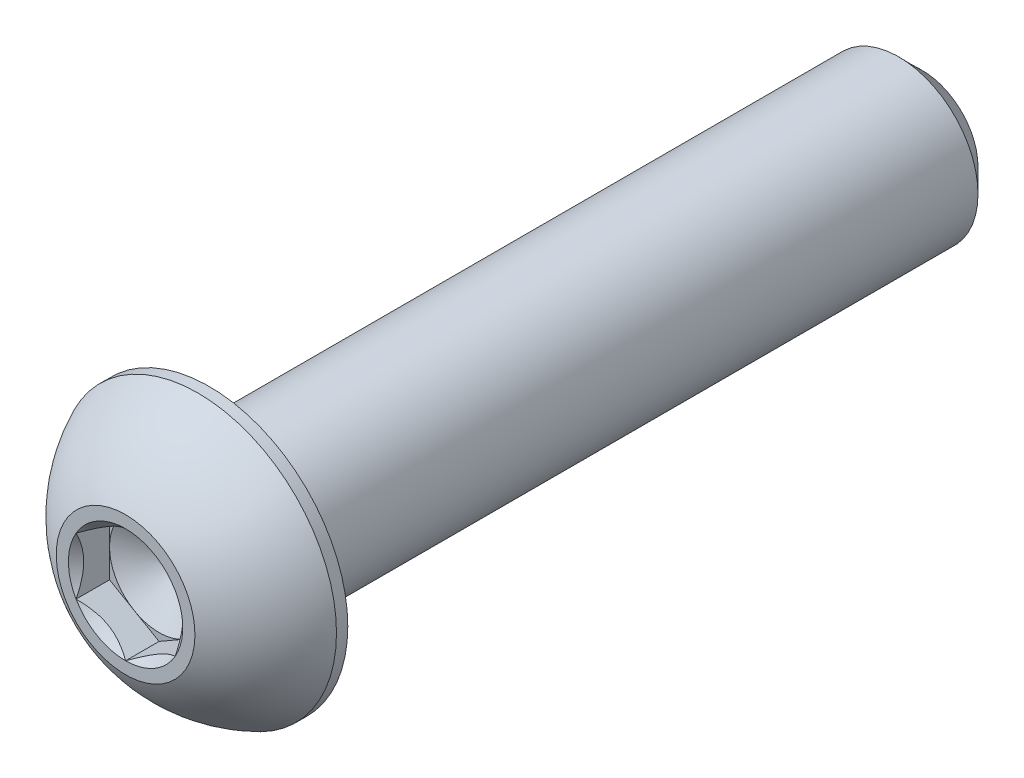
ISO-10303-21;
HEADER;
FILE_DESCRIPTION(('STEP AP214'),'2;1');
FILE_NAME('part.step','',(''),(''),'','','');
FILE_SCHEMA(('AUTOMOTIVE_DESIGN { 1 0 10303 214 1 1 1 1 }'));
ENDSEC;
DATA;
#1=APPLICATION_CONTEXT('core data for automotive mechanical design processes');
#2=APPLICATION_PROTOCOL_DEFINITION('international standard','automotive_design',2000,#1);
#3=PRODUCT_CONTEXT('',#1,'mechanical');
#4=PRODUCT('Part','Part','',(#3));
#5=PRODUCT_RELATED_PRODUCT_CATEGORY('part','',(#4));
#6=PRODUCT_DEFINITION_FORMATION('','',#4);
#7=PRODUCT_DEFINITION_CONTEXT('part definition',#1,'design');
#8=PRODUCT_DEFINITION('design','',#6,#7);
#9=PRODUCT_DEFINITION_SHAPE('','',#8);
#10=(LENGTH_UNIT() NAMED_UNIT(*) SI_UNIT(.MILLI.,.METRE.));
#11=(NAMED_UNIT(*) PLANE_ANGLE_UNIT() SI_UNIT($,.RADIAN.));
#12=(NAMED_UNIT(*) SI_UNIT($,.STERADIAN.) SOLID_ANGLE_UNIT());
#13=UNCERTAINTY_MEASURE_WITH_UNIT(LENGTH_MEASURE(1.E-05),#10,'distance_accuracy_value','');
#14=(GEOMETRIC_REPRESENTATION_CONTEXT(3) GLOBAL_UNCERTAINTY_ASSIGNED_CONTEXT((#13)) GLOBAL_UNIT_ASSIGNED_CONTEXT((#10,
#11,#12)) REPRESENTATION_CONTEXT('',''));
#15=CARTESIAN_POINT('',(0.,0.,0.));
#16=DIRECTION('',(0.,0.,1.));
#17=DIRECTION('',(1.,0.,0.));
#18=AXIS2_PLACEMENT_3D('',#15,#16,#17);
#19=CARTESIAN_POINT('',(0.,1.984375,15.9639));
#20=DIRECTION('',(0.,0.,-1.));
#21=DIRECTION('',(-1.,0.,0.));
#22=AXIS2_PLACEMENT_3D('',#19,#20,#21);
#23=PLANE('',#22);
#24=CARTESIAN_POINT('',(0.,0.,15.9639));
#25=DIRECTION('',(0.,0.,1.));
#26=DIRECTION('',(1.,0.,0.));
#27=AXIS2_PLACEMENT_3D('',#24,#25,#26);
#28=CIRCLE('',#27,2.778125);
#29=CARTESIAN_POINT('',(0.,2.778125,15.9639));
#30=VERTEX_POINT('',#29);
#31=EDGE_CURVE('E169',#30,#30,#28,.T.);
#32=ORIENTED_EDGE('',*,*,#31,.T.);
#33=EDGE_LOOP('',(#32));
#34=FACE_BOUND('',#33,.T.);
#35=CARTESIAN_POINT('',(0.,0.,15.9639));
#36=DIRECTION('',(0.,0.,1.));
#37=DIRECTION('',(1.,0.,0.));
#38=AXIS2_PLACEMENT_3D('',#35,#36,#37);
#39=CIRCLE('',#38,2.29135888084633);
#40=CARTESIAN_POINT('',(0.,2.29135888084633,15.9639));
#41=VERTEX_POINT('',#40);
#42=CARTESIAN_POINT('',(-1.984375,1.14567944042316,15.9639));
#43=VERTEX_POINT('',#42);
#44=EDGE_CURVE('E123',#41,#43,#39,.T.);
#45=ORIENTED_EDGE('',*,*,#44,.F.);
#46=CARTESIAN_POINT('',(0.,0.,15.9639));
#47=DIRECTION('',(0.,0.,1.));
#48=DIRECTION('',(1.,0.,0.));
#49=AXIS2_PLACEMENT_3D('',#46,#47,#48);
#50=CIRCLE('',#49,2.29135888084633);
#51=CARTESIAN_POINT('',(1.984375,1.14567944042316,15.9639));
#52=VERTEX_POINT('',#51);
#53=EDGE_CURVE('E108',#52,#41,#50,.T.);
#54=ORIENTED_EDGE('',*,*,#53,.F.);
#55=CARTESIAN_POINT('',(0.,0.,15.9639));
#56=DIRECTION('',(0.,0.,1.));
#57=DIRECTION('',(1.,0.,0.));
#58=AXIS2_PLACEMENT_3D('',#55,#56,#57);
#59=CIRCLE('',#58,2.29135888084633);
#60=CARTESIAN_POINT('',(1.984375,-1.14567944042316,15.9639));
#61=VERTEX_POINT('',#60);
#62=EDGE_CURVE('E119',#61,#52,#59,.T.);
#63=ORIENTED_EDGE('',*,*,#62,.F.);
#64=CARTESIAN_POINT('',(0.,0.,15.9639));
#65=DIRECTION('',(0.,0.,1.));
#66=DIRECTION('',(1.,0.,0.));
#67=AXIS2_PLACEMENT_3D('',#64,#65,#66);
#68=CIRCLE('',#67,2.29135888084633);
#69=CARTESIAN_POINT('',(0.,-2.29135888084633,15.9639));
#70=VERTEX_POINT('',#69);
#71=EDGE_CURVE('E140',#70,#61,#68,.T.);
#72=ORIENTED_EDGE('',*,*,#71,.F.);
#73=CARTESIAN_POINT('',(0.,0.,15.9639));
#74=DIRECTION('',(0.,0.,1.));
#75=DIRECTION('',(1.,0.,0.));
#76=AXIS2_PLACEMENT_3D('',#73,#74,#75);
#77=CIRCLE('',#76,2.29135888084633);
#78=CARTESIAN_POINT('',(-1.984375,-1.14567944042317,15.9639));
#79=VERTEX_POINT('',#78);
#80=EDGE_CURVE('E440',#79,#70,#77,.T.);
#81=ORIENTED_EDGE('',*,*,#80,.F.);
#82=CARTESIAN_POINT('',(0.,0.,15.9639));
#83=DIRECTION('',(0.,0.,1.));
#84=DIRECTION('',(1.,0.,0.));
#85=AXIS2_PLACEMENT_3D('',#82,#83,#84);
#86=CIRCLE('',#85,2.29135888084633);
#87=EDGE_CURVE('E449',#43,#79,#86,.T.);
#88=ORIENTED_EDGE('',*,*,#87,.F.);
#89=EDGE_LOOP('',(#45,#54,#63,#72,#81,#88));
#90=FACE_BOUND('',#89,.T.);
#91=ADVANCED_FACE('F35',(#34,#90),#23,.F.);
#92=CARTESIAN_POINT('',(0.,0.,-15.9639));
#93=DIRECTION('',(0.,0.,1.));
#94=DIRECTION('',(1.,0.,0.));
#95=AXIS2_PLACEMENT_3D('',#92,#93,#94);
#96=CONICAL_SURFACE('',#95,2.22250000000001,0.785398163397445);
#97=CARTESIAN_POINT('',(0.,0.,-15.0114));
#98=DIRECTION('',(0.,0.,1.));
#99=DIRECTION('',(1.,0.,0.));
#100=AXIS2_PLACEMENT_3D('',#97,#98,#99);
#101=CIRCLE('',#100,3.175);
#102=CARTESIAN_POINT('',(3.175,0.,-15.0114));
#103=VERTEX_POINT('',#102);
#104=EDGE_CURVE('E11',#103,#103,#101,.T.);
#105=ORIENTED_EDGE('',*,*,#104,.F.);
#106=EDGE_LOOP('',(#105));
#107=FACE_BOUND('',#106,.T.);
#108=CARTESIAN_POINT('',(0.,0.,-15.9639));
#109=DIRECTION('',(0.,0.,1.));
#110=DIRECTION('',(1.,0.,0.));
#111=AXIS2_PLACEMENT_3D('',#108,#109,#110);
#112=CIRCLE('',#111,2.22250000000001);
#113=CARTESIAN_POINT('',(2.22250000000001,0.,-15.9639));
#114=VERTEX_POINT('',#113);
#115=EDGE_CURVE('E162',#114,#114,#112,.T.);
#116=ORIENTED_EDGE('',*,*,#115,.T.);
#117=EDGE_LOOP('',(#116));
#118=FACE_BOUND('',#117,.T.);
#119=ADVANCED_FACE('F37',(#107,#118),#96,.T.);
#120=CARTESIAN_POINT('',(0.,0.,15.9639));
#121=DIRECTION('',(0.,0.,1.));
#122=DIRECTION('',(1.,0.,0.));
#123=AXIS2_PLACEMENT_3D('',#120,#121,#122);
#124=CYLINDRICAL_SURFACE('',#123,3.175);
#125=CARTESIAN_POINT('',(0.,0.,12.6111));
#126=DIRECTION('',(0.,0.,1.));
#127=DIRECTION('',(1.,0.,0.));
#128=AXIS2_PLACEMENT_3D('',#125,#126,#127);
#129=CIRCLE('',#128,3.175);
#130=CARTESIAN_POINT('',(3.175,0.,12.6111));
#131=VERTEX_POINT('',#130);
#132=EDGE_CURVE('E43',#131,#131,#129,.T.);
#133=ORIENTED_EDGE('',*,*,#132,.F.);
#134=EDGE_LOOP('',(#133));
#135=FACE_BOUND('',#134,.T.);
#136=ORIENTED_EDGE('',*,*,#104,.T.);
#137=EDGE_LOOP('',(#136));
#138=FACE_BOUND('',#137,.T.);
#139=ADVANCED_FACE('F183',(#135,#138),#124,.T.);
#140=CARTESIAN_POINT('',(0.,5.5499,12.6111));
#141=DIRECTION('',(0.,0.,1.));
#142=DIRECTION('',(1.,0.,0.));
#143=AXIS2_PLACEMENT_3D('',#140,#141,#142);
#144=PLANE('',#143);
#145=CARTESIAN_POINT('',(0.,0.,12.6111));
#146=DIRECTION('',(0.,0.,1.));
#147=DIRECTION('',(1.,0.,0.));
#148=AXIS2_PLACEMENT_3D('',#145,#146,#147);
#149=CIRCLE('',#148,5.5499);
#150=CARTESIAN_POINT('',(5.5499,0.,12.6111));
#151=VERTEX_POINT('',#150);
#152=EDGE_CURVE('E176',#151,#151,#149,.T.);
#153=ORIENTED_EDGE('',*,*,#152,.F.);
#154=EDGE_LOOP('',(#153));
#155=FACE_BOUND('',#154,.T.);
#156=ORIENTED_EDGE('',*,*,#132,.T.);
#157=EDGE_LOOP('',(#156));
#158=FACE_BOUND('',#157,.T.);
#159=ADVANCED_FACE('F181',(#155,#158),#144,.F.);
#160=CARTESIAN_POINT('',(0.,0.,15.9639));
#161=DIRECTION('',(0.,0.,1.));
#162=DIRECTION('',(1.,0.,0.));
#163=AXIS2_PLACEMENT_3D('',#160,#161,#162);
#164=CYLINDRICAL_SURFACE('',#163,5.5499);
#165=CARTESIAN_POINT('',(0.,0.,13.0646714285714));
#166=DIRECTION('',(0.,0.,1.));
#167=DIRECTION('',(1.,0.,0.));
#168=AXIS2_PLACEMENT_3D('',#165,#166,#167);
#169=CIRCLE('',#168,5.5499);
#170=CARTESIAN_POINT('',(0.,5.5499,13.0646714285714));
#171=VERTEX_POINT('',#170);
#172=EDGE_CURVE('E173',#171,#171,#169,.T.);
#173=ORIENTED_EDGE('',*,*,#172,.F.);
#174=EDGE_LOOP('',(#173));
#175=FACE_BOUND('',#174,.T.);
#176=ORIENTED_EDGE('',*,*,#152,.T.);
#177=EDGE_LOOP('',(#176));
#178=FACE_BOUND('',#177,.T.);
#179=ADVANCED_FACE('F202',(#175,#178),#164,.T.);
#180=CARTESIAN_POINT('',(0.,0.,10.5333282068546));
#181=DIRECTION('',(0.,0.,1.));
#182=DIRECTION('',(0.,1.,0.));
#183=AXIS2_PLACEMENT_3D('',#180,#181,#182);
#184=SPHERICAL_SURFACE('',#183,6.09992528775);
#185=CARTESIAN_POINT('',(0.,2.778125,15.9639));
#186=CARTESIAN_POINT('',(0.,2.81602671338564,15.9445106477222));
#187=CARTESIAN_POINT('',(0.,2.85372537445918,15.9247243821891));
#188=CARTESIAN_POINT('',(0.,2.92870021164798,15.8843669699155));
#189=CARTESIAN_POINT('',(0.,2.96597638776324,15.8637958231749));
#190=CARTESIAN_POINT('',(0.,3.04008987470139,15.8218775937889));
#191=CARTESIAN_POINT('',(0.,3.07692718552427,15.8005305111435));
#192=CARTESIAN_POINT('',(0.,3.15014680356086,15.7570697876022));
#193=CARTESIAN_POINT('',(0.,3.18652911077458,15.7349561467063));
#194=CARTESIAN_POINT('',(0.,3.25882276944387,15.6899719956597));
#195=CARTESIAN_POINT('',(0.,3.29473412089945,15.667101485509));
#196=CARTESIAN_POINT('',(0.,3.36607012592493,15.6206136233654));
#197=CARTESIAN_POINT('',(0.,3.40149477949484,15.5969962713726));
#198=CARTESIAN_POINT('',(0.,3.47184185902622,15.5490250785858));
#199=CARTESIAN_POINT('',(0.,3.50676428498768,15.5246712377917));
#200=CARTESIAN_POINT('',(0.,3.57609160000261,15.4752377437818));
#201=CARTESIAN_POINT('',(0.,3.61049648905608,15.4501580905659));
#202=CARTESIAN_POINT('',(0.,3.67877364776563,15.3992839661473));
#203=CARTESIAN_POINT('',(0.,3.71264591742172,15.3734894949444));
#204=CARTESIAN_POINT('',(0.,3.77984298835613,15.3211970423841));
#205=CARTESIAN_POINT('',(0.,3.81316778963445,15.2946990610266));
#206=CARTESIAN_POINT('',(0.,3.87925531482814,15.2410112043859));
#207=CARTESIAN_POINT('',(0.,3.91201803874352,15.2138213291027));
#208=CARTESIAN_POINT('',(0.,3.97696704663191,15.1587616041558));
#209=CARTESIAN_POINT('',(0.,4.00915333060493,15.1308917544921));
#210=CARTESIAN_POINT('',(0.,4.07293534872958,15.0744842984171));
#211=CARTESIAN_POINT('',(0.,4.10453108288122,15.0459466920057));
#212=CARTESIAN_POINT('',(0.,4.16711815037044,14.9882162328008));
#213=CARTESIAN_POINT('',(0.,4.19810948370803,14.9590233800072));
#214=CARTESIAN_POINT('',(0.,4.25947416353471,14.8999952256512));
#215=CARTESIAN_POINT('',(0.,4.28984751002382,14.8701599240888));
#216=CARTESIAN_POINT('',(0.,4.34996290103328,14.8098599514462));
#217=CARTESIAN_POINT('',(0.,4.37970494555363,14.7793952803661));
#218=CARTESIAN_POINT('',(0.,4.43854469425657,14.7178499238436));
#219=CARTESIAN_POINT('',(0.,4.46764239843916,14.6867692384012));
#220=CARTESIAN_POINT('',(0.,4.52518071056457,14.6240054783587));
#221=CARTESIAN_POINT('',(0.,4.55362131850739,14.5923224037587));
#222=CARTESIAN_POINT('',(0.,4.60983297031029,14.5283677546821));
#223=CARTESIAN_POINT('',(0.,4.63760401417035,14.4960961802057));
#224=CARTESIAN_POINT('',(0.,4.6924643634894,14.430978678645));
#225=CARTESIAN_POINT('',(0.,4.71955366894839,14.3981327515608));
#226=CARTESIAN_POINT('',(0.,4.77303866600855,14.3318809438392));
#227=CARTESIAN_POINT('',(0.,4.79943435760973,14.2984750632017));
#228=CARTESIAN_POINT('',(0.,4.85152055556542,14.2311179929015));
#229=CARTESIAN_POINT('',(0.,4.87721106191991,14.1971668032387));
#230=CARTESIAN_POINT('',(0.,4.927875627133,14.1287339984688));
#231=CARTESIAN_POINT('',(0.,4.95284968599158,14.0942523833617));
#232=CARTESIAN_POINT('',(0.,5.00207040804361,14.0247738438145));
#233=CARTESIAN_POINT('',(0.,5.02631707123706,13.9897769193743));
#234=CARTESIAN_POINT('',(0.,5.0740723726572,13.9192831031697));
#235=CARTESIAN_POINT('',(0.,5.09758101088389,13.8837862114053));
#236=CARTESIAN_POINT('',(0.,5.1438499566405,13.8123080217543));
#237=CARTESIAN_POINT('',(0.,5.16661026417041,13.7763267238678));
#238=CARTESIAN_POINT('',(0.,5.21137257072764,13.7038954954669));
#239=CARTESIAN_POINT('',(0.,5.23337456975495,13.6674455649525));
#240=CARTESIAN_POINT('',(0.,5.276610614416,13.5940930504643));
#241=CARTESIAN_POINT('',(0.,5.29784466004975,13.5571904664905));
#242=CARTESIAN_POINT('',(0.,5.33953548787471,13.4829488218128));
#243=CARTESIAN_POINT('',(0.,5.35999227006592,13.445609761109));
#244=CARTESIAN_POINT('',(0.,5.40011960846765,13.370511534306));
#245=CARTESIAN_POINT('',(0.,5.41979016467818,13.3327523682069));
#246=CARTESIAN_POINT('',(0.,5.45833640797136,13.2568304739407));
#247=CARTESIAN_POINT('',(0.,5.47721209505402,13.2186677457736));
#248=CARTESIAN_POINT('',(0.,5.51416039973219,13.1419554930474));
#249=CARTESIAN_POINT('',(0.,5.53223301732771,13.1034059684884));
#250=CARTESIAN_POINT('',(0.,5.5499,13.0646714285714));
#251=B_SPLINE_CURVE_WITH_KNOTS('',3,(#185,#186,#187,#188,#189,#190,#191,#192,#193,#194,#195,
#196,#197,#198,#199,#200,#201,#202,#203,#204,#205,#206,#207,#208,#209,#210,#211,#212,#213,#214,
#215,#216,#217,#218,#219,#220,#221,#222,#223,#224,#225,#226,#227,#228,#229,#230,#231,#232,#233,
#234,#235,#236,#237,#238,#239,#240,#241,#242,#243,#244,#245,#246,#247,#248,#249,#250),
.UNSPECIFIED.,.F.,.F.,(4,2,2,2,2,2,2,2,2,2,2,2,2,2,2,2,2,2,2,2,2,2,2,2,2,2,2,2,2,2,2,2,4),(0.,
0.127717597491553,0.255435194983109,0.383152792474661,0.510870389966215,0.63858798745777,
0.766305584949323,0.894023182440878,1.02174077993243,1.14945837742399,1.27717597491554,
1.40489357240709,1.53261116989865,1.6603287673902,1.78804636488176,1.91576396237331,
2.04348155986486,2.17119915735642,2.29891675484797,2.42663435233953,2.55435194983108,
2.68206954732263,2.80978714481419,2.93750474230574,3.0652223397973,3.19293993728885,
3.32065753478041,3.44837513227196,3.57609272976351,3.70381032725507,3.83152792474662,
3.95924552223817,4.08696311972973),.UNSPECIFIED.);
#252=EDGE_CURVE('BSEAM194',#30,#171,#251,.T.);
#253=ORIENTED_EDGE('',*,*,#31,.F.);
#254=ORIENTED_EDGE('',*,*,#172,.T.);
#255=ORIENTED_EDGE('',*,*,#252,.T.);
#256=ORIENTED_EDGE('',*,*,#252,.F.);
#257=EDGE_LOOP('',(#253,#255,#254,#256));
#258=FACE_BOUND('',#257,.T.);
#259=ADVANCED_FACE('F194',(#258),#184,.T.);
#260=CARTESIAN_POINT('',(0.,2.22250000000001,-15.9639));
#261=DIRECTION('',(0.,0.,1.));
#262=DIRECTION('',(1.,0.,0.));
#263=AXIS2_PLACEMENT_3D('',#260,#261,#262);
#264=PLANE('',#263);
#265=ORIENTED_EDGE('',*,*,#115,.F.);
#266=EDGE_LOOP('',(#265));
#267=FACE_BOUND('',#266,.T.);
#268=ADVANCED_FACE('F192',(#267),#264,.F.);
#269=CARTESIAN_POINT('',(1.984375,1.14567944042316,15.9639));
#270=DIRECTION('',(-0.499999999999999,-0.866025403784439,0.));
#271=DIRECTION('',(0.866025403784439,-0.499999999999999,0.));
#272=AXIS2_PLACEMENT_3D('',#269,#270,#271);
#273=PLANE('',#272);
#274=CARTESIAN_POINT('',(1.984575,1.14556397036933,15.9640154787818));
#275=CARTESIAN_POINT('',(1.9163590048332,1.18494849354192,15.9246628522639));
#276=CARTESIAN_POINT('',(1.84700231489303,1.22499159714897,15.8876213104462));
#277=CARTESIAN_POINT('',(1.70557619954781,1.30664400291398,15.8197988584233));
#278=CARTESIAN_POINT('',(1.63349332126322,1.34826107209555,15.7890556890918));
#279=CARTESIAN_POINT('',(1.488141602734,1.43217992591557,15.7363918888112));
#280=CARTESIAN_POINT('',(1.41490978751306,1.47446033414663,15.71433887588));
#281=CARTESIAN_POINT('',(1.26683381740529,1.55995203534886,15.6803614929439));
#282=CARTESIAN_POINT('',(1.19199418724658,1.60316071596705,15.6684117560917));
#283=CARTESIAN_POINT('',(1.06301458545618,1.6776271237807,15.6576300990819));
#284=CARTESIAN_POINT('',(1.00904128422756,1.7087886237741,15.6560338990591));
#285=CARTESIAN_POINT('',(0.901182881480199,1.77106070163465,15.6587218388653));
#286=CARTESIAN_POINT('',(0.847297817514476,1.80217125782056,15.6630080403405));
#287=CARTESIAN_POINT('',(0.740036461751395,1.86409863044402,15.6772168730135));
#288=CARTESIAN_POINT('',(0.686660807239859,1.89491507894443,15.6871458104523));
#289=CARTESIAN_POINT('',(0.580832482591103,1.95601509066828,15.7120950842745));
#290=CARTESIAN_POINT('',(0.528379742028898,1.9862986945516,15.7271150303895));
#291=CARTESIAN_POINT('',(0.39401766103635,2.06387267818152,15.7717078516357));
#292=CARTESIAN_POINT('',(0.312941642841674,2.11068193911104,15.8046429959383));
#293=CARTESIAN_POINT('',(0.19372669327016,2.17951072233758,15.8602424412022));
#294=CARTESIAN_POINT('',(0.154440075613998,2.20219286161692,15.8797775920519));
#295=CARTESIAN_POINT('',(0.0765946381319468,2.24713694590237,15.9206287381194));
#296=CARTESIAN_POINT('',(0.0380353888983003,2.26939913882716,15.9419436395684));
#297=CARTESIAN_POINT('',(-0.000200000000001343,2.29147435090017,15.9640154787818));
#298=B_SPLINE_CURVE_WITH_KNOTS('',3,(#274,#275,#276,#277,#278,#279,#280,#281,#282,#283,#284,
#285,#286,#287,#288,#289,#290,#291,#292,#293,#294,#295,#296,#297),.UNSPECIFIED.,.F.,.F.,(4,2,2,
2,2,2,2,2,2,2,2,4),(0.,0.264339630306628,0.530219665093697,0.791876416371462,1.05287424418109,
1.239639843932,1.42647091743852,1.61351120244035,1.80053715247541,2.09764209964317,
2.24579179873714,2.39385111134157),.UNSPECIFIED.);
#299=EDGE_CURVE('E105',#52,#41,#298,.T.);
#300=ORIENTED_EDGE('',*,*,#299,.T.);
#301=DIRECTION('',(0.,0.,-1.));
#302=VECTOR('',#301,1.);
#303=CARTESIAN_POINT('',(0.,2.29135888084633,15.9639));
#304=LINE('',#303,#302);
#305=CARTESIAN_POINT('',(0.,2.29135888084633,14.62278));
#306=VERTEX_POINT('',#305);
#307=EDGE_CURVE('E160',#41,#306,#304,.T.);
#308=ORIENTED_EDGE('',*,*,#307,.T.);
#309=DIRECTION('',(-0.866025403784439,0.499999999999999,0.));
#310=VECTOR('',#309,1.);
#311=CARTESIAN_POINT('',(1.984375,1.14567944042316,14.62278));
#312=LINE('',#311,#310);
#313=CARTESIAN_POINT('',(0.992187499999998,1.71851916063475,14.62278));
#314=VERTEX_POINT('',#313);
#315=EDGE_CURVE('E476',#314,#306,#312,.T.);
#316=ORIENTED_EDGE('',*,*,#315,.F.);
#317=CARTESIAN_POINT('',(1.984375,1.14567944042316,14.62278));
#318=VERTEX_POINT('',#317);
#319=EDGE_CURVE('E50',#318,#314,#312,.T.);
#320=ORIENTED_EDGE('',*,*,#319,.F.);
#321=DIRECTION('',(0.,0.,-1.));
#322=VECTOR('',#321,1.);
#323=CARTESIAN_POINT('',(1.984375,1.14567944042316,15.9639));
#324=LINE('',#323,#322);
#325=EDGE_CURVE('E136',#52,#318,#324,.T.);
#326=ORIENTED_EDGE('',*,*,#325,.F.);
#327=EDGE_LOOP('',(#300,#308,#316,#320,#326));
#328=FACE_BOUND('',#327,.T.);
#329=ADVANCED_FACE('F142',(#328),#273,.T.);
#330=CARTESIAN_POINT('',(0.,2.29135888084633,15.9639));
#331=DIRECTION('',(0.5,-0.866025403784438,0.));
#332=DIRECTION('',(0.866025403784438,0.5,0.));
#333=AXIS2_PLACEMENT_3D('',#330,#331,#332);
#334=PLANE('',#333);
#335=CARTESIAN_POINT('',(0.000199999999998693,2.29147435090016,15.9640154787818));
#336=CARTESIAN_POINT('',(-0.0680159951668039,2.25208982772757,15.9246628522639));
#337=CARTESIAN_POINT('',(-0.137372685106967,2.21204672412052,15.8876213104462));
#338=CARTESIAN_POINT('',(-0.278798800452189,2.13039431835551,15.8197988584233));
#339=CARTESIAN_POINT('',(-0.350881678736783,2.08877724917394,15.7890556890918));
#340=CARTESIAN_POINT('',(-0.496233397266004,2.00485839535392,15.7363918888112));
#341=CARTESIAN_POINT('',(-0.569465212486939,1.96257798712287,15.71433887588));
#342=CARTESIAN_POINT('',(-0.717541182594706,1.87708628592063,15.6803614929439));
#343=CARTESIAN_POINT('',(-0.792380812753424,1.83387760530244,15.6684117560917));
#344=CARTESIAN_POINT('',(-0.921360414543814,1.75941119748879,15.6576300990819));
#345=CARTESIAN_POINT('',(-0.975333715772441,1.72824969749539,15.6560338990591));
#346=CARTESIAN_POINT('',(-1.0831921185198,1.66597761963484,15.6587218388653));
#347=CARTESIAN_POINT('',(-1.13707718248552,1.63486706344893,15.6630080403405));
#348=CARTESIAN_POINT('',(-1.2443385382486,1.57293969082547,15.6772168730135));
#349=CARTESIAN_POINT('',(-1.29771419276014,1.54212324232506,15.6871458104523));
#350=CARTESIAN_POINT('',(-1.4035425174089,1.48102323060122,15.7120950842745));
#351=CARTESIAN_POINT('',(-1.4559952579711,1.45073962671789,15.7271150303895));
#352=CARTESIAN_POINT('',(-1.59035733896365,1.37316564308797,15.7717078516357));
#353=CARTESIAN_POINT('',(-1.67143335715832,1.32635638215845,15.8046429959383));
#354=CARTESIAN_POINT('',(-1.79064830672984,1.25752759893191,15.8602424412022));
#355=CARTESIAN_POINT('',(-1.829934924386,1.23484545965257,15.8797775920519));
#356=CARTESIAN_POINT('',(-1.90778036186805,1.18990137536712,15.9206287381194));
#357=CARTESIAN_POINT('',(-1.9463396111017,1.16763918244233,15.9419436395684));
#358=CARTESIAN_POINT('',(-1.984575,1.14556397036932,15.9640154787818));
#359=B_SPLINE_CURVE_WITH_KNOTS('',3,(#335,#336,#337,#338,#339,#340,#341,#342,#343,#344,#345,
#346,#347,#348,#349,#350,#351,#352,#353,#354,#355,#356,#357,#358),.UNSPECIFIED.,.F.,.F.,(4,2,2,
2,2,2,2,2,2,2,2,4),(0.,0.264339630306627,0.530219665093694,0.791876416371458,1.05287424418109,
1.239639843932,1.42647091743852,1.61351120244034,1.8005371524754,2.09764209964316,
2.24579179873714,2.39385111134157),.UNSPECIFIED.);
#360=EDGE_CURVE('E464',#41,#43,#359,.T.);
#361=ORIENTED_EDGE('',*,*,#360,.T.);
#362=DIRECTION('',(0.,0.,-1.));
#363=VECTOR('',#362,1.);
#364=CARTESIAN_POINT('',(-1.984375,1.14567944042316,15.9639));
#365=LINE('',#364,#363);
#366=CARTESIAN_POINT('',(-1.984375,1.14567944042316,14.62278));
#367=VERTEX_POINT('',#366);
#368=EDGE_CURVE('E157',#43,#367,#365,.T.);
#369=ORIENTED_EDGE('',*,*,#368,.T.);
#370=DIRECTION('',(-0.866025403784438,-0.5,0.));
#371=VECTOR('',#370,1.);
#372=CARTESIAN_POINT('',(0.,2.29135888084633,14.62278));
#373=LINE('',#372,#371);
#374=CARTESIAN_POINT('',(-0.992187500000001,1.71851916063474,14.62278));
#375=VERTEX_POINT('',#374);
#376=EDGE_CURVE('E478',#375,#367,#373,.T.);
#377=ORIENTED_EDGE('',*,*,#376,.F.);
#378=EDGE_CURVE('E479',#306,#375,#373,.T.);
#379=ORIENTED_EDGE('',*,*,#378,.F.);
#380=ORIENTED_EDGE('',*,*,#307,.F.);
#381=EDGE_LOOP('',(#361,#369,#377,#379,#380));
#382=FACE_BOUND('',#381,.T.);
#383=ADVANCED_FACE('F200',(#382),#334,.T.);
#384=CARTESIAN_POINT('',(-1.984375,1.14567944042316,15.9639));
#385=DIRECTION('',(1.,0.,0.));
#386=DIRECTION('',(0.,0.,-1.));
#387=AXIS2_PLACEMENT_3D('',#384,#385,#386);
#388=PLANE('',#387);
#389=CARTESIAN_POINT('',(-1.984375,-2.24664989492636,16.6700700833169));
#390=CARTESIAN_POINT('',(-1.984375,-2.19177035879914,16.6289466992886));
#391=CARTESIAN_POINT('',(-1.984375,-2.1365793309425,16.5882329661326));
#392=CARTESIAN_POINT('',(-1.984375,-2.0254530694156,16.5078048670618));
#393=CARTESIAN_POINT('',(-1.984375,-1.9695176484433,16.4680907602265));
#394=CARTESIAN_POINT('',(-1.984375,-1.85637247000972,16.3895599960499));
#395=CARTESIAN_POINT('',(-1.984375,-1.79915619451492,16.3507526850203));
#396=CARTESIAN_POINT('',(-1.984375,-1.68374612486123,16.2746311665578));
#397=CARTESIAN_POINT('',(-1.984375,-1.62555240093273,16.2373168524981));
#398=CARTESIAN_POINT('',(-1.984375,-1.44283684202777,16.124067942359));
#399=CARTESIAN_POINT('',(-1.984375,-1.31636516124236,16.0512214191006));
#400=CARTESIAN_POINT('',(-1.984375,-1.05716498260296,15.9182117557776));
#401=CARTESIAN_POINT('',(-1.984375,-0.924459462264124,15.8580059196547));
#402=CARTESIAN_POINT('',(-1.984375,-0.724893074141589,15.7843618396154));
#403=CARTESIAN_POINT('',(-1.984375,-0.660907572248813,15.7631629174856));
#404=CARTESIAN_POINT('',(-1.984375,-0.531425551080247,15.7259071147974));
#405=CARTESIAN_POINT('',(-1.984375,-0.465928924835295,15.7098505994633));
#406=CARTESIAN_POINT('',(-1.984375,-0.334891945890407,15.6839708434592));
#407=CARTESIAN_POINT('',(-1.984375,-0.269372555502923,15.6740431015484));
#408=CARTESIAN_POINT('',(-1.984375,-0.137675185771463,15.6606085903106));
#409=CARTESIAN_POINT('',(-1.984375,-0.071497313578065,15.6571007929468));
#410=CARTESIAN_POINT('',(-1.984375,0.0586431546448462,15.6567516482374));
#411=CARTESIAN_POINT('',(-1.984375,0.122605247687116,15.6596896245911));
#412=CARTESIAN_POINT('',(-1.984375,0.249962419599662,15.6715917091826));
#413=CARTESIAN_POINT('',(-1.984375,0.313357441624569,15.6805564148524));
#414=CARTESIAN_POINT('',(-1.984375,0.440194078343454,15.7041811503476));
#415=CARTESIAN_POINT('',(-1.984375,0.503617615772963,15.7189367997364));
#416=CARTESIAN_POINT('',(-1.984375,0.629083701047628,15.7533707574727));
#417=CARTESIAN_POINT('',(-1.984375,0.691126376772747,15.773048607898));
#418=CARTESIAN_POINT('',(-1.984375,0.888252191671361,15.8429251863326));
#419=CARTESIAN_POINT('',(-1.984375,1.02048040542614,15.9011555893404));
#420=CARTESIAN_POINT('',(-1.984375,1.27871806100266,16.0305691802767));
#421=CARTESIAN_POINT('',(-1.984375,1.40470281207755,16.1017992719574));
#422=CARTESIAN_POINT('',(-1.984375,1.5867785992022,16.2129129319412));
#423=CARTESIAN_POINT('',(-1.984375,1.64484387516128,16.2496238248926));
#424=CARTESIAN_POINT('',(-1.984375,1.75997827817988,16.3245874476375));
#425=CARTESIAN_POINT('',(-1.984375,1.81704732901583,16.3628402946748));
#426=CARTESIAN_POINT('',(-1.984375,1.92985499213403,16.4402867819938));
#427=CARTESIAN_POINT('',(-1.984375,1.98560066211377,16.4794701932287));
#428=CARTESIAN_POINT('',(-1.984375,2.09633159947626,16.5588666099261));
#429=CARTESIAN_POINT('',(-1.984375,2.15131707145808,16.5990793297131));
#430=CARTESIAN_POINT('',(-1.984375,2.20598450458982,16.63971347261));
#431=B_SPLINE_CURVE_WITH_KNOTS('',3,(#389,#390,#391,#392,#393,#394,#395,#396,#397,#398,#399,
#400,#401,#402,#403,#404,#405,#406,#407,#408,#409,#410,#411,#412,#413,#414,#415,#416,#417,#418,
#419,#420,#421,#422,#423,#424,#425,#426,#427,#428,#429,#430),.UNSPECIFIED.,.F.,.F.,(4,2,2,2,2,2,
2,2,2,2,2,2,2,2,2,2,2,2,2,2,4),(0.,0.205736210356763,0.411525204809806,0.618909845914795,
0.826279649489807,1.26374370453551,1.69970549535382,1.90175047418286,2.10380979948048,
2.3023211047986,2.50080061937433,2.69259135253523,2.88440110079442,3.07952109080018,
3.27462293514803,3.70679897011889,4.14056631296021,4.34663769336142,4.552724772271,
4.75712951108819,4.96147812147718),.UNSPECIFIED.);
#432=EDGE_CURVE('E457',#43,#79,#431,.F.);
#433=ORIENTED_EDGE('',*,*,#432,.T.);
#434=DIRECTION('',(0.,0.,-1.));
#435=VECTOR('',#434,1.);
#436=CARTESIAN_POINT('',(-1.984375,-1.14567944042317,15.9639));
#437=LINE('',#436,#435);
#438=CARTESIAN_POINT('',(-1.984375,-1.14567944042317,14.62278));
#439=VERTEX_POINT('',#438);
#440=EDGE_CURVE('E154',#79,#439,#437,.T.);
#441=ORIENTED_EDGE('',*,*,#440,.T.);
#442=DIRECTION('',(0.,-1.,0.));
#443=VECTOR('',#442,1.);
#444=CARTESIAN_POINT('',(-1.984375,1.14567944042316,14.62278));
#445=LINE('',#444,#443);
#446=CARTESIAN_POINT('',(-1.984375,0.,14.62278));
#447=VERTEX_POINT('',#446);
#448=EDGE_CURVE('E482',#447,#439,#445,.T.);
#449=ORIENTED_EDGE('',*,*,#448,.F.);
#450=EDGE_CURVE('E483',#367,#447,#445,.T.);
#451=ORIENTED_EDGE('',*,*,#450,.F.);
#452=ORIENTED_EDGE('',*,*,#368,.F.);
#453=EDGE_LOOP('',(#433,#441,#449,#451,#452));
#454=FACE_BOUND('',#453,.T.);
#455=ADVANCED_FACE('F321',(#454),#388,.T.);
#456=CARTESIAN_POINT('',(-1.984375,-1.14567944042317,15.9639));
#457=DIRECTION('',(0.499999999999999,0.866025403784439,0.));
#458=DIRECTION('',(-0.866025403784439,0.5,0.));
#459=AXIS2_PLACEMENT_3D('',#456,#457,#458);
#460=PLANE('',#459);
#461=CARTESIAN_POINT('',(-1.984575,-1.14556397036933,15.9640154787818));
#462=CARTESIAN_POINT('',(-1.9163590048332,-1.18494849354192,15.9246628522639));
#463=CARTESIAN_POINT('',(-1.84700231489304,-1.22499159714897,15.8876213104462));
#464=CARTESIAN_POINT('',(-1.70557619954782,-1.30664400291398,15.8197988584233));
#465=CARTESIAN_POINT('',(-1.63349332126322,-1.34826107209555,15.7890556890918));
#466=CARTESIAN_POINT('',(-1.488141602734,-1.43217992591557,15.7363918888112));
#467=CARTESIAN_POINT('',(-1.41490978751307,-1.47446033414662,15.71433887588));
#468=CARTESIAN_POINT('',(-1.2668338174053,-1.55995203534886,15.6803614929439));
#469=CARTESIAN_POINT('',(-1.19199418724658,-1.60316071596705,15.6684117560917));
#470=CARTESIAN_POINT('',(-1.06301458545619,-1.6776271237807,15.6576300990819));
#471=CARTESIAN_POINT('',(-1.00904128422756,-1.7087886237741,15.6560338990591));
#472=CARTESIAN_POINT('',(-0.901182881480203,-1.77106070163465,15.6587218388653));
#473=CARTESIAN_POINT('',(-0.84729781751448,-1.80217125782056,15.6630080403405));
#474=CARTESIAN_POINT('',(-0.740036461751399,-1.86409863044402,15.6772168730135));
#475=CARTESIAN_POINT('',(-0.686660807239863,-1.89491507894443,15.6871458104523));
#476=CARTESIAN_POINT('',(-0.580832482591107,-1.95601509066827,15.7120950842745));
#477=CARTESIAN_POINT('',(-0.528379742028902,-1.9862986945516,15.7271150303895));
#478=CARTESIAN_POINT('',(-0.394017661036354,-2.06387267818152,15.7717078516357));
#479=CARTESIAN_POINT('',(-0.312941642841679,-2.11068193911104,15.8046429959383));
#480=CARTESIAN_POINT('',(-0.193726693270162,-2.17951072233758,15.8602424412022));
#481=CARTESIAN_POINT('',(-0.154440075613999,-2.20219286161692,15.8797775920519));
#482=CARTESIAN_POINT('',(-0.0765946381319461,-2.24713694590237,15.9206287381194));
#483=CARTESIAN_POINT('',(-0.0380353888983,-2.26939913882716,15.9419436395684));
#484=CARTESIAN_POINT('',(0.00020000000000092,-2.29147435090017,15.9640154787818));
#485=B_SPLINE_CURVE_WITH_KNOTS('',3,(#461,#462,#463,#464,#465,#466,#467,#468,#469,#470,#471,
#472,#473,#474,#475,#476,#477,#478,#479,#480,#481,#482,#483,#484),.UNSPECIFIED.,.F.,.F.,(4,2,2,
2,2,2,2,2,2,2,2,4),(0.,0.264339630306622,0.530219665093689,0.791876416371455,1.05287424418109,
1.239639843932,1.42647091743852,1.61351120244034,1.8005371524754,2.09764209964316,
2.24579179873713,2.39385111134157),.UNSPECIFIED.);
#486=EDGE_CURVE('E442',#79,#70,#485,.T.);
#487=ORIENTED_EDGE('',*,*,#486,.T.);
#488=DIRECTION('',(0.,0.,-1.));
#489=VECTOR('',#488,1.);
#490=CARTESIAN_POINT('',(0.,-2.29135888084633,15.9639));
#491=LINE('',#490,#489);
#492=CARTESIAN_POINT('',(0.,-2.29135888084633,14.62278));
#493=VERTEX_POINT('',#492);
#494=EDGE_CURVE('E145',#70,#493,#491,.T.);
#495=ORIENTED_EDGE('',*,*,#494,.T.);
#496=DIRECTION('',(0.866025403784439,-0.499999999999999,0.));
#497=VECTOR('',#496,1.);
#498=CARTESIAN_POINT('',(-1.984375,-1.14567944042317,14.62278));
#499=LINE('',#498,#497);
#500=CARTESIAN_POINT('',(-0.992187499999999,-1.71851916063475,14.62278));
#501=VERTEX_POINT('',#500);
#502=EDGE_CURVE('E486',#501,#493,#499,.T.);
#503=ORIENTED_EDGE('',*,*,#502,.F.);
#504=EDGE_CURVE('E487',#439,#501,#499,.T.);
#505=ORIENTED_EDGE('',*,*,#504,.F.);
#506=ORIENTED_EDGE('',*,*,#440,.F.);
#507=EDGE_LOOP('',(#487,#495,#503,#505,#506));
#508=FACE_BOUND('',#507,.T.);
#509=ADVANCED_FACE('F331',(#508),#460,.T.);
#510=CARTESIAN_POINT('',(0.,-2.29135888084633,15.9639));
#511=DIRECTION('',(-0.5,0.866025403784438,0.));
#512=DIRECTION('',(-0.866025403784438,-0.5,0.));
#513=AXIS2_PLACEMENT_3D('',#510,#511,#512);
#514=PLANE('',#513);
#515=CARTESIAN_POINT('',(-0.000199999999997776,-2.29147435090017,15.9640154787818));
#516=CARTESIAN_POINT('',(0.0680159951668048,-2.25208982772757,15.9246628522639));
#517=CARTESIAN_POINT('',(0.137372685106968,-2.21204672412052,15.8876213104462));
#518=CARTESIAN_POINT('',(0.278798800452189,-2.13039431835551,15.8197988584233));
#519=CARTESIAN_POINT('',(0.350881678736785,-2.08877724917394,15.7890556890918));
#520=CARTESIAN_POINT('',(0.496233397266005,-2.00485839535392,15.7363918888112));
#521=CARTESIAN_POINT('',(0.569465212486939,-1.96257798712287,15.71433887588));
#522=CARTESIAN_POINT('',(0.717541182594707,-1.87708628592063,15.6803614929439));
#523=CARTESIAN_POINT('',(0.792380812753426,-1.83387760530244,15.6684117560917));
#524=CARTESIAN_POINT('',(0.921360414543818,-1.75941119748879,15.6576300990819));
#525=CARTESIAN_POINT('',(0.975333715772444,-1.72824969749539,15.6560338990591));
#526=CARTESIAN_POINT('',(1.0831921185198,-1.66597761963484,15.6587218388653));
#527=CARTESIAN_POINT('',(1.13707718248553,-1.63486706344893,15.6630080403405));
#528=CARTESIAN_POINT('',(1.24433853824861,-1.57293969082547,15.6772168730135));
#529=CARTESIAN_POINT('',(1.29771419276014,-1.54212324232506,15.6871458104523));
#530=CARTESIAN_POINT('',(1.4035425174089,-1.48102323060122,15.7120950842745));
#531=CARTESIAN_POINT('',(1.4559952579711,-1.45073962671789,15.7271150303895));
#532=CARTESIAN_POINT('',(1.59035733896365,-1.37316564308797,15.7717078516357));
#533=CARTESIAN_POINT('',(1.67143335715833,-1.32635638215845,15.8046429959383));
#534=CARTESIAN_POINT('',(1.79064830672984,-1.25752759893191,15.8602424412022));
#535=CARTESIAN_POINT('',(1.829934924386,-1.23484545965257,15.8797775920519));
#536=CARTESIAN_POINT('',(1.90778036186805,-1.18990137536713,15.9206287381194));
#537=CARTESIAN_POINT('',(1.9463396111017,-1.16763918244233,15.9419436395684));
#538=CARTESIAN_POINT('',(1.984575,-1.14556397036933,15.9640154787818));
#539=B_SPLINE_CURVE_WITH_KNOTS('',3,(#515,#516,#517,#518,#519,#520,#521,#522,#523,#524,#525,
#526,#527,#528,#529,#530,#531,#532,#533,#534,#535,#536,#537,#538),.UNSPECIFIED.,.F.,.F.,(4,2,2,
2,2,2,2,2,2,2,2,4),(0.,0.264339630306625,0.530219665093692,0.791876416371457,1.05287424418109,
1.239639843932,1.42647091743852,1.61351120244034,1.8005371524754,2.09764209964316,
2.24579179873713,2.39385111134157),.UNSPECIFIED.);
#540=EDGE_CURVE('E433',#70,#61,#539,.T.);
#541=ORIENTED_EDGE('',*,*,#540,.T.);
#542=DIRECTION('',(0.,0.,-1.));
#543=VECTOR('',#542,1.);
#544=CARTESIAN_POINT('',(1.984375,-1.14567944042316,15.9639));
#545=LINE('',#544,#543);
#546=CARTESIAN_POINT('',(1.984375,-1.14567944042316,14.62278));
#547=VERTEX_POINT('',#546);
#548=EDGE_CURVE('E139',#61,#547,#545,.T.);
#549=ORIENTED_EDGE('',*,*,#548,.T.);
#550=DIRECTION('',(0.866025403784438,0.5,0.));
#551=VECTOR('',#550,1.);
#552=CARTESIAN_POINT('',(0.,-2.29135888084633,14.62278));
#553=LINE('',#552,#551);
#554=CARTESIAN_POINT('',(0.992187500000001,-1.71851916063475,14.62278));
#555=VERTEX_POINT('',#554);
#556=EDGE_CURVE('E489',#555,#547,#553,.T.);
#557=ORIENTED_EDGE('',*,*,#556,.F.);
#558=EDGE_CURVE('E490',#493,#555,#553,.T.);
#559=ORIENTED_EDGE('',*,*,#558,.F.);
#560=ORIENTED_EDGE('',*,*,#494,.F.);
#561=EDGE_LOOP('',(#541,#549,#557,#559,#560));
#562=FACE_BOUND('',#561,.T.);
#563=ADVANCED_FACE('F341',(#562),#514,.T.);
#564=CARTESIAN_POINT('',(1.984375,-1.14567944042316,15.9639));
#565=DIRECTION('',(-1.,0.,0.));
#566=DIRECTION('',(0.,-1.,0.));
#567=AXIS2_PLACEMENT_3D('',#564,#565,#566);
#568=PLANE('',#567);
#569=CARTESIAN_POINT('',(1.984375,-2.24664989492635,16.6700700833169));
#570=CARTESIAN_POINT('',(1.984375,-2.19177035879913,16.6289466992886));
#571=CARTESIAN_POINT('',(1.984375,-2.1365793309425,16.5882329661326));
#572=CARTESIAN_POINT('',(1.984375,-2.0254530694156,16.5078048670618));
#573=CARTESIAN_POINT('',(1.984375,-1.96951764844329,16.4680907602265));
#574=CARTESIAN_POINT('',(1.984375,-1.85637247000972,16.3895599960499));
#575=CARTESIAN_POINT('',(1.984375,-1.79915619451491,16.3507526850203));
#576=CARTESIAN_POINT('',(1.984375,-1.68374612486123,16.2746311665578));
#577=CARTESIAN_POINT('',(1.984375,-1.62555240093273,16.2373168524981));
#578=CARTESIAN_POINT('',(1.984375,-1.44283684202776,16.124067942359));
#579=CARTESIAN_POINT('',(1.984375,-1.31636516124235,16.0512214191006));
#580=CARTESIAN_POINT('',(1.984375,-1.05716498260296,15.9182117557776));
#581=CARTESIAN_POINT('',(1.984375,-0.92445946226412,15.8580059196547));
#582=CARTESIAN_POINT('',(1.984375,-0.724893074141586,15.7843618396154));
#583=CARTESIAN_POINT('',(1.984375,-0.660907572248812,15.7631629174856));
#584=CARTESIAN_POINT('',(1.984375,-0.531425551080246,15.7259071147974));
#585=CARTESIAN_POINT('',(1.984375,-0.465928924835294,15.7098505994633));
#586=CARTESIAN_POINT('',(1.984375,-0.334891945890404,15.6839708434592));
#587=CARTESIAN_POINT('',(1.984375,-0.26937255550292,15.6740431015484));
#588=CARTESIAN_POINT('',(1.984375,-0.137675185771461,15.6606085903106));
#589=CARTESIAN_POINT('',(1.984375,-0.0714973135780629,15.6571007929468));
#590=CARTESIAN_POINT('',(1.984375,0.0586431546448481,15.6567516482373));
#591=CARTESIAN_POINT('',(1.984375,0.122605247687119,15.6596896245911));
#592=CARTESIAN_POINT('',(1.984375,0.249962419599664,15.6715917091826));
#593=CARTESIAN_POINT('',(1.984375,0.313357441624571,15.6805564148524));
#594=CARTESIAN_POINT('',(1.984375,0.440194078343455,15.7041811503476));
#595=CARTESIAN_POINT('',(1.984375,0.503617615772964,15.7189367997364));
#596=CARTESIAN_POINT('',(1.984375,0.629083701047629,15.7533707574727));
#597=CARTESIAN_POINT('',(1.984375,0.691126376772749,15.773048607898));
#598=CARTESIAN_POINT('',(1.984375,0.888252191671362,15.8429251863326));
#599=CARTESIAN_POINT('',(1.984375,1.02048040542614,15.9011555893404));
#600=CARTESIAN_POINT('',(1.984375,1.27871806100267,16.0305691802767));
#601=CARTESIAN_POINT('',(1.984375,1.40470281207756,16.1017992719575));
#602=CARTESIAN_POINT('',(1.984375,1.5867785992022,16.2129129319412));
#603=CARTESIAN_POINT('',(1.984375,1.64484387516129,16.2496238248926));
#604=CARTESIAN_POINT('',(1.984375,1.75997827817988,16.3245874476375));
#605=CARTESIAN_POINT('',(1.984375,1.81704732901584,16.3628402946748));
#606=CARTESIAN_POINT('',(1.984375,1.92985499213404,16.4402867819938));
#607=CARTESIAN_POINT('',(1.984375,1.98560066211377,16.4794701932287));
#608=CARTESIAN_POINT('',(1.984375,2.09633159947626,16.5588666099261));
#609=CARTESIAN_POINT('',(1.984375,2.15131707145809,16.5990793297131));
#610=CARTESIAN_POINT('',(1.984375,2.20598450458982,16.63971347261));
#611=B_SPLINE_CURVE_WITH_KNOTS('',3,(#569,#570,#571,#572,#573,#574,#575,#576,#577,#578,#579,
#580,#581,#582,#583,#584,#585,#586,#587,#588,#589,#590,#591,#592,#593,#594,#595,#596,#597,#598,
#599,#600,#601,#602,#603,#604,#605,#606,#607,#608,#609,#610),.UNSPECIFIED.,.F.,.F.,(4,2,2,2,2,2,
2,2,2,2,2,2,2,2,2,2,2,2,2,2,4),(0.,0.205736210356767,0.411525204809808,0.618909845914794,
0.826279649489806,1.26374370453551,1.69970549535382,1.90175047418286,2.10380979948048,
2.3023211047986,2.50080061937433,2.69259135253523,2.88440110079442,3.07952109080018,
3.27462293514803,3.70679897011888,4.14056631296021,4.34663769336142,4.552724772271,
4.75712951108819,4.96147812147718),.UNSPECIFIED.);
#612=EDGE_CURVE('E129',#61,#52,#611,.T.);
#613=ORIENTED_EDGE('',*,*,#612,.T.);
#614=ORIENTED_EDGE('',*,*,#325,.T.);
#615=DIRECTION('',(0.,1.,0.));
#616=VECTOR('',#615,1.);
#617=CARTESIAN_POINT('',(1.984375,-1.14567944042316,14.62278));
#618=LINE('',#617,#616);
#619=CARTESIAN_POINT('',(1.984375,0.,14.62278));
#620=VERTEX_POINT('',#619);
#621=EDGE_CURVE('E148',#620,#318,#618,.T.);
#622=ORIENTED_EDGE('',*,*,#621,.F.);
#623=EDGE_CURVE('E143',#547,#620,#618,.T.);
#624=ORIENTED_EDGE('',*,*,#623,.F.);
#625=ORIENTED_EDGE('',*,*,#548,.F.);
#626=EDGE_LOOP('',(#613,#614,#622,#624,#625));
#627=FACE_BOUND('',#626,.T.);
#628=ADVANCED_FACE('F134',(#627),#568,.T.);
#629=CARTESIAN_POINT('',(0.,0.,14.62278));
#630=DIRECTION('',(0.,0.,1.));
#631=DIRECTION('',(1.,0.,0.));
#632=AXIS2_PLACEMENT_3D('',#629,#630,#631);
#633=PLANE('',#632);
#634=CARTESIAN_POINT('',(0.,0.,14.62278));
#635=DIRECTION('',(0.,0.,1.));
#636=DIRECTION('',(1.,0.,0.));
#637=AXIS2_PLACEMENT_3D('',#634,#635,#636);
#638=CIRCLE('',#637,1.984375);
#639=EDGE_CURVE('E165',#555,#620,#638,.T.);
#640=ORIENTED_EDGE('',*,*,#639,.F.);
#641=ORIENTED_EDGE('',*,*,#556,.T.);
#642=ORIENTED_EDGE('',*,*,#623,.T.);
#643=EDGE_LOOP('',(#640,#641,#642));
#644=FACE_BOUND('',#643,.T.);
#645=ADVANCED_FACE('F243',(#644),#633,.T.);
#646=EDGE_CURVE('E502',#501,#555,#638,.T.);
#647=ORIENTED_EDGE('',*,*,#646,.F.);
#648=ORIENTED_EDGE('',*,*,#502,.T.);
#649=ORIENTED_EDGE('',*,*,#558,.T.);
#650=EDGE_LOOP('',(#647,#648,#649));
#651=FACE_BOUND('',#650,.T.);
#652=ADVANCED_FACE('F248',(#651),#633,.T.);
#653=EDGE_CURVE('E503',#447,#501,#638,.T.);
#654=ORIENTED_EDGE('',*,*,#653,.F.);
#655=ORIENTED_EDGE('',*,*,#448,.T.);
#656=ORIENTED_EDGE('',*,*,#504,.T.);
#657=EDGE_LOOP('',(#654,#655,#656));
#658=FACE_BOUND('',#657,.T.);
#659=ADVANCED_FACE('F261',(#658),#633,.T.);
#660=EDGE_CURVE('E504',#375,#447,#638,.T.);
#661=ORIENTED_EDGE('',*,*,#660,.F.);
#662=ORIENTED_EDGE('',*,*,#376,.T.);
#663=ORIENTED_EDGE('',*,*,#450,.T.);
#664=EDGE_LOOP('',(#661,#662,#663));
#665=FACE_BOUND('',#664,.T.);
#666=ADVANCED_FACE('F270',(#665),#633,.T.);
#667=EDGE_CURVE('E170',#314,#375,#638,.T.);
#668=ORIENTED_EDGE('',*,*,#667,.F.);
#669=ORIENTED_EDGE('',*,*,#315,.T.);
#670=ORIENTED_EDGE('',*,*,#378,.T.);
#671=EDGE_LOOP('',(#668,#669,#670));
#672=FACE_BOUND('',#671,.T.);
#673=ADVANCED_FACE('F279',(#672),#633,.T.);
#674=EDGE_CURVE('E166',#620,#314,#638,.T.);
#675=ORIENTED_EDGE('',*,*,#674,.F.);
#676=ORIENTED_EDGE('',*,*,#621,.T.);
#677=ORIENTED_EDGE('',*,*,#319,.T.);
#678=EDGE_LOOP('',(#675,#676,#677));
#679=FACE_BOUND('',#678,.T.);
#680=ADVANCED_FACE('F251',(#679),#633,.T.);
#681=CARTESIAN_POINT('',(0.,0.,14.62278));
#682=DIRECTION('',(0.,0.,1.));
#683=DIRECTION('',(1.,0.,0.));
#684=AXIS2_PLACEMENT_3D('',#681,#682,#683);
#685=CONICAL_SURFACE('',#684,1.984375,1.0471975511966);
#686=CARTESIAN_POINT('',(0.,0.,13.4771005595768));
#687=VERTEX_POINT('',#686);
#688=VERTEX_LOOP('',#687);
#689=FACE_BOUND('',#688,.T.);
#690=ORIENTED_EDGE('',*,*,#674,.T.);
#691=ORIENTED_EDGE('',*,*,#667,.T.);
#692=ORIENTED_EDGE('',*,*,#660,.T.);
#693=ORIENTED_EDGE('',*,*,#653,.T.);
#694=ORIENTED_EDGE('',*,*,#646,.T.);
#695=ORIENTED_EDGE('',*,*,#639,.T.);
#696=EDGE_LOOP('',(#690,#691,#692,#693,#694,#695));
#697=FACE_BOUND('',#696,.T.);
#698=ADVANCED_FACE('F211',(#689,#697),#685,.F.);
#699=CARTESIAN_POINT('',(0.,0.,15.9639));
#700=DIRECTION('',(0.,0.,1.));
#701=DIRECTION('',(1.,0.,0.));
#702=AXIS2_PLACEMENT_3D('',#699,#700,#701);
#703=CONICAL_SURFACE('',#702,2.29135888084633,0.78539816339745);
#704=ORIENTED_EDGE('',*,*,#44,.T.);
#705=ORIENTED_EDGE('',*,*,#360,.F.);
#706=EDGE_LOOP('',(#704,#705));
#707=FACE_BOUND('',#706,.T.);
#708=ADVANCED_FACE('F302',(#707),#703,.F.);
#709=CARTESIAN_POINT('',(0.,0.,15.9639));
#710=DIRECTION('',(0.,0.,1.));
#711=DIRECTION('',(1.,0.,0.));
#712=AXIS2_PLACEMENT_3D('',#709,#710,#711);
#713=CONICAL_SURFACE('',#712,2.29135888084633,0.78539816339745);
#714=ORIENTED_EDGE('',*,*,#87,.T.);
#715=ORIENTED_EDGE('',*,*,#432,.F.);
#716=EDGE_LOOP('',(#714,#715));
#717=FACE_BOUND('',#716,.T.);
#718=ADVANCED_FACE('F364',(#717),#713,.F.);
#719=CARTESIAN_POINT('',(0.,0.,15.9639));
#720=DIRECTION('',(0.,0.,1.));
#721=DIRECTION('',(1.,0.,0.));
#722=AXIS2_PLACEMENT_3D('',#719,#720,#721);
#723=CONICAL_SURFACE('',#722,2.29135888084633,0.78539816339745);
#724=ORIENTED_EDGE('',*,*,#80,.T.);
#725=ORIENTED_EDGE('',*,*,#486,.F.);
#726=EDGE_LOOP('',(#724,#725));
#727=FACE_BOUND('',#726,.T.);
#728=ADVANCED_FACE('F374',(#727),#723,.F.);
#729=CARTESIAN_POINT('',(0.,0.,15.9639));
#730=DIRECTION('',(0.,0.,1.));
#731=DIRECTION('',(1.,0.,0.));
#732=AXIS2_PLACEMENT_3D('',#729,#730,#731);
#733=CONICAL_SURFACE('',#732,2.29135888084633,0.78539816339745);
#734=ORIENTED_EDGE('',*,*,#71,.T.);
#735=ORIENTED_EDGE('',*,*,#540,.F.);
#736=EDGE_LOOP('',(#734,#735));
#737=FACE_BOUND('',#736,.T.);
#738=ADVANCED_FACE('F384',(#737),#733,.F.);
#739=CARTESIAN_POINT('',(0.,0.,15.9639));
#740=DIRECTION('',(0.,0.,1.));
#741=DIRECTION('',(1.,0.,0.));
#742=AXIS2_PLACEMENT_3D('',#739,#740,#741);
#743=CONICAL_SURFACE('',#742,2.29135888084633,0.78539816339745);
#744=ORIENTED_EDGE('',*,*,#62,.T.);
#745=ORIENTED_EDGE('',*,*,#612,.F.);
#746=EDGE_LOOP('',(#744,#745));
#747=FACE_BOUND('',#746,.T.);
#748=ADVANCED_FACE('F128',(#747),#743,.F.);
#749=CARTESIAN_POINT('',(0.,0.,15.9639));
#750=DIRECTION('',(0.,0.,1.));
#751=DIRECTION('',(1.,0.,0.));
#752=AXIS2_PLACEMENT_3D('',#749,#750,#751);
#753=CONICAL_SURFACE('',#752,2.29135888084633,0.78539816339745);
#754=ORIENTED_EDGE('',*,*,#53,.T.);
#755=ORIENTED_EDGE('',*,*,#299,.F.);
#756=EDGE_LOOP('',(#754,#755));
#757=FACE_BOUND('',#756,.T.);
#758=ADVANCED_FACE('F107',(#757),#753,.F.);
#759=CLOSED_SHELL('',(#91,#119,#139,#159,#179,#259,#268,#329,#383,#455,#509,#563,#628,#645,#652,
#659,#666,#673,#680,#698,#708,#718,#728,#738,#748,#758));
#760=MANIFOLD_SOLID_BREP('B2',#759);
#761=ADVANCED_BREP_SHAPE_REPRESENTATION('',(#18,#760),#14);
#762=SHAPE_DEFINITION_REPRESENTATION(#9,#761);
ENDSEC;
END-ISO-10303-21;
